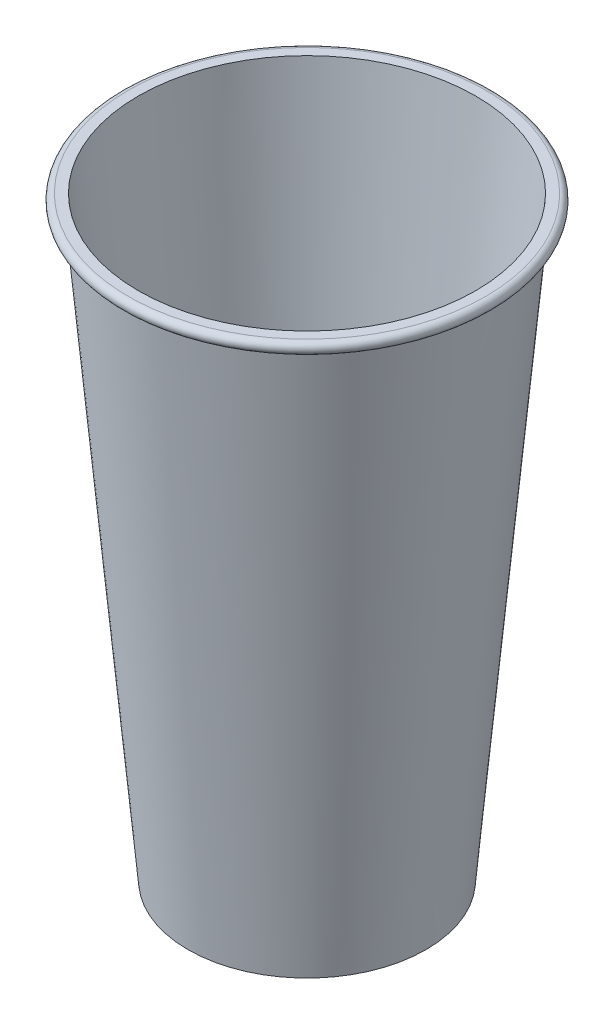
ISO-10303-21;
HEADER;
FILE_DESCRIPTION(('STEP AP214'),'2;1');
FILE_NAME('part.step','',(''),(''),'','','');
FILE_SCHEMA(('AUTOMOTIVE_DESIGN { 1 0 10303 214 1 1 1 1 }'));
ENDSEC;
DATA;
#1=APPLICATION_CONTEXT('core data for automotive mechanical design processes');
#2=APPLICATION_PROTOCOL_DEFINITION('international standard','automotive_design',2000,#1);
#3=PRODUCT_CONTEXT('',#1,'mechanical');
#4=PRODUCT('Part','Part','',(#3));
#5=PRODUCT_RELATED_PRODUCT_CATEGORY('part','',(#4));
#6=PRODUCT_DEFINITION_FORMATION('','',#4);
#7=PRODUCT_DEFINITION_CONTEXT('part definition',#1,'design');
#8=PRODUCT_DEFINITION('design','',#6,#7);
#9=PRODUCT_DEFINITION_SHAPE('','',#8);
#10=(LENGTH_UNIT() NAMED_UNIT(*) SI_UNIT(.MILLI.,.METRE.));
#11=(NAMED_UNIT(*) PLANE_ANGLE_UNIT() SI_UNIT($,.RADIAN.));
#12=(NAMED_UNIT(*) SI_UNIT($,.STERADIAN.) SOLID_ANGLE_UNIT());
#13=UNCERTAINTY_MEASURE_WITH_UNIT(LENGTH_MEASURE(1.E-05),#10,'distance_accuracy_value','');
#14=(GEOMETRIC_REPRESENTATION_CONTEXT(3) GLOBAL_UNCERTAINTY_ASSIGNED_CONTEXT((#13)) GLOBAL_UNIT_ASSIGNED_CONTEXT((#10,
#11,#12)) REPRESENTATION_CONTEXT('',''));
#15=CARTESIAN_POINT('',(0.,0.,0.));
#16=DIRECTION('',(0.,0.,1.));
#17=DIRECTION('',(1.,0.,0.));
#18=AXIS2_PLACEMENT_3D('',#15,#16,#17);
#19=CARTESIAN_POINT('',(0.,-1.,0.));
#20=DIRECTION('',(0.,1.,0.));
#21=DIRECTION('',(0.,0.,1.));
#22=AXIS2_PLACEMENT_3D('',#19,#20,#21);
#23=CYLINDRICAL_SURFACE('',#22,25.);
#24=CARTESIAN_POINT('',(0.,-1.,0.));
#25=DIRECTION('',(0.,-1.,0.));
#26=DIRECTION('',(0.,0.,-1.));
#27=AXIS2_PLACEMENT_3D('',#24,#25,#26);
#28=CIRCLE('',#27,25.);
#29=CARTESIAN_POINT('',(0.,-1.,-25.));
#30=VERTEX_POINT('',#29);
#31=EDGE_CURVE('E12',#30,#30,#28,.T.);
#32=ORIENTED_EDGE('',*,*,#31,.F.);
#33=EDGE_LOOP('',(#32));
#34=FACE_BOUND('',#33,.T.);
#35=CARTESIAN_POINT('',(0.,0.,0.));
#36=DIRECTION('',(0.,-1.,0.));
#37=DIRECTION('',(0.,0.,-1.));
#38=AXIS2_PLACEMENT_3D('',#35,#36,#37);
#39=CIRCLE('',#38,25.);
#40=CARTESIAN_POINT('',(0.,0.,-25.));
#41=VERTEX_POINT('',#40);
#42=EDGE_CURVE('E44',#41,#41,#39,.T.);
#43=ORIENTED_EDGE('',*,*,#42,.T.);
#44=EDGE_LOOP('',(#43));
#45=FACE_BOUND('',#44,.T.);
#46=ADVANCED_FACE('F41',(#34,#45),#23,.T.);
#47=CARTESIAN_POINT('',(0.,-1.,0.));
#48=DIRECTION('',(0.,-1.,0.));
#49=DIRECTION('',(0.,0.,-1.));
#50=AXIS2_PLACEMENT_3D('',#47,#48,#49);
#51=PLANE('',#50);
#52=ORIENTED_EDGE('',*,*,#31,.T.);
#53=EDGE_LOOP('',(#52));
#54=FACE_BOUND('',#53,.T.);
#55=ADVANCED_FACE('F56',(#54),#51,.T.);
#56=CARTESIAN_POINT('',(0.,0.,0.));
#57=DIRECTION('',(0.,-1.,0.));
#58=DIRECTION('',(0.,0.,-1.));
#59=AXIS2_PLACEMENT_3D('',#56,#57,#58);
#60=PLANE('',#59);
#61=ORIENTED_EDGE('',*,*,#42,.F.);
#62=EDGE_LOOP('',(#61));
#63=FACE_BOUND('',#62,.T.);
#64=ADVANCED_FACE('F54',(#63),#60,.F.);
#65=CLOSED_SHELL('',(#46,#55,#64));
#66=MANIFOLD_SOLID_BREP('B2',#65);
#67=CARTESIAN_POINT('',(0.,0.,0.));
#68=DIRECTION('',(0.,1.,0.));
#69=DIRECTION('',(0.,0.,1.));
#70=AXIS2_PLACEMENT_3D('',#67,#68,#69);
#71=CONICAL_SURFACE('',#70,30.,0.0897581741899505);
#72=CARTESIAN_POINT('',(0.,0.,0.));
#73=DIRECTION('',(0.,1.,0.));
#74=DIRECTION('',(0.,0.,1.));
#75=AXIS2_PLACEMENT_3D('',#72,#73,#74);
#76=CIRCLE('',#75,30.);
#77=CARTESIAN_POINT('',(0.,0.,30.));
#78=VERTEX_POINT('',#77);
#79=EDGE_CURVE('E40',#78,#78,#76,.T.);
#80=ORIENTED_EDGE('',*,*,#79,.T.);
#81=EDGE_LOOP('',(#80));
#82=FACE_BOUND('',#81,.T.);
#83=CARTESIAN_POINT('',(0.,147.,0.));
#84=DIRECTION('',(0.,1.,0.));
#85=DIRECTION('',(-1.,0.,0.));
#86=AXIS2_PLACEMENT_3D('',#83,#84,#85);
#87=CIRCLE('',#86,43.23);
#88=CARTESIAN_POINT('',(-43.23,147.,0.));
#89=VERTEX_POINT('',#88);
#90=EDGE_CURVE('E143',#89,#89,#87,.T.);
#91=ORIENTED_EDGE('',*,*,#90,.F.);
#92=EDGE_LOOP('',(#91));
#93=FACE_BOUND('',#92,.T.);
#94=ADVANCED_FACE('F82',(#82,#93),#71,.T.);
#95=CARTESIAN_POINT('',(0.,0.,0.));
#96=DIRECTION('',(0.,1.,0.));
#97=DIRECTION('',(0.,0.,1.));
#98=AXIS2_PLACEMENT_3D('',#95,#96,#97);
#99=PLANE('',#98);
#100=CARTESIAN_POINT('',(0.,0.,0.));
#101=DIRECTION('',(0.,1.,0.));
#102=DIRECTION('',(0.,0.,1.));
#103=AXIS2_PLACEMENT_3D('',#100,#101,#102);
#104=CIRCLE('',#103,28.9959581682021);
#105=CARTESIAN_POINT('',(0.,0.,28.9959581682021));
#106=VERTEX_POINT('',#105);
#107=EDGE_CURVE('E91',#106,#106,#104,.T.);
#108=ORIENTED_EDGE('',*,*,#107,.T.);
#109=EDGE_LOOP('',(#108));
#110=FACE_BOUND('',#109,.T.);
#111=ORIENTED_EDGE('',*,*,#79,.F.);
#112=EDGE_LOOP('',(#111));
#113=FACE_BOUND('',#112,.T.);
#114=ADVANCED_FACE('F84',(#110,#113),#99,.F.);
#115=CARTESIAN_POINT('',(0.,150.,0.));
#116=DIRECTION('',(0.,1.,0.));
#117=DIRECTION('',(0.,0.,1.));
#118=AXIS2_PLACEMENT_3D('',#115,#116,#117);
#119=PLANE('',#118);
#120=CARTESIAN_POINT('',(0.,150.,0.));
#121=DIRECTION('',(0.,1.,0.));
#122=DIRECTION('',(0.,0.,1.));
#123=AXIS2_PLACEMENT_3D('',#120,#121,#122);
#124=CIRCLE('',#123,42.4959581682021);
#125=CARTESIAN_POINT('',(0.,150.,42.4959581682021));
#126=VERTEX_POINT('',#125);
#127=EDGE_CURVE('E96',#126,#126,#124,.T.);
#128=ORIENTED_EDGE('',*,*,#127,.F.);
#129=EDGE_LOOP('',(#128));
#130=FACE_BOUND('',#129,.T.);
#131=CARTESIAN_POINT('',(0.,150.,0.));
#132=DIRECTION('',(0.,1.,0.));
#133=DIRECTION('',(-1.,0.,0.));
#134=AXIS2_PLACEMENT_3D('',#131,#132,#133);
#135=CIRCLE('',#134,45.);
#136=CARTESIAN_POINT('',(-45.,150.,0.));
#137=VERTEX_POINT('',#136);
#138=EDGE_CURVE('E139',#137,#137,#135,.T.);
#139=ORIENTED_EDGE('',*,*,#138,.T.);
#140=EDGE_LOOP('',(#139));
#141=FACE_BOUND('',#140,.T.);
#142=ADVANCED_FACE('F119',(#130,#141),#119,.T.);
#143=CARTESIAN_POINT('',(0.,0.0896376994958906,0.));
#144=DIRECTION('',(0.,1.,0.));
#145=DIRECTION('',(0.,0.,1.));
#146=AXIS2_PLACEMENT_3D('',#143,#144,#145);
#147=CONICAL_SURFACE('',#146,29.0040255611568,0.0897581741899505);
#148=ORIENTED_EDGE('',*,*,#127,.T.);
#149=EDGE_LOOP('',(#148));
#150=FACE_BOUND('',#149,.T.);
#151=ORIENTED_EDGE('',*,*,#107,.F.);
#152=EDGE_LOOP('',(#151));
#153=FACE_BOUND('',#152,.T.);
#154=ADVANCED_FACE('F122',(#150,#153),#147,.F.);
#155=CARTESIAN_POINT('',(43.23,147.,0.));
#156=DIRECTION('',(0.,1.,0.));
#157=DIRECTION('',(-1.,0.,0.));
#158=AXIS2_PLACEMENT_3D('',#155,#156,#157);
#159=PLANE('',#158);
#160=CARTESIAN_POINT('',(0.,147.,0.));
#161=DIRECTION('',(0.,1.,0.));
#162=DIRECTION('',(-1.,0.,0.));
#163=AXIS2_PLACEMENT_3D('',#160,#161,#162);
#164=CIRCLE('',#163,45.);
#165=CARTESIAN_POINT('',(-45.,147.,0.));
#166=VERTEX_POINT('',#165);
#167=EDGE_CURVE('E142',#166,#166,#164,.T.);
#168=ORIENTED_EDGE('',*,*,#167,.F.);
#169=EDGE_LOOP('',(#168));
#170=FACE_BOUND('',#169,.T.);
#171=ORIENTED_EDGE('',*,*,#90,.T.);
#172=EDGE_LOOP('',(#171));
#173=FACE_BOUND('',#172,.T.);
#174=ADVANCED_FACE('F126',(#170,#173),#159,.F.);
#175=CARTESIAN_POINT('',(0.,148.5,0.));
#176=DIRECTION('',(0.,1.,0.));
#177=DIRECTION('',(-1.,0.,0.));
#178=AXIS2_PLACEMENT_3D('',#175,#176,#177);
#179=TOROIDAL_SURFACE('',#178,45.,1.5);
#180=ORIENTED_EDGE('',*,*,#138,.F.);
#181=EDGE_LOOP('',(#180));
#182=FACE_BOUND('',#181,.T.);
#183=ORIENTED_EDGE('',*,*,#167,.T.);
#184=EDGE_LOOP('',(#183));
#185=FACE_BOUND('',#184,.T.);
#186=ADVANCED_FACE('F130',(#182,#185),#179,.T.);
#187=CLOSED_SHELL('',(#94,#114,#142,#154,#174,#186));
#188=MANIFOLD_SOLID_BREP('B7',#187);
#189=ADVANCED_BREP_SHAPE_REPRESENTATION('',(#18,#66,#188),#14);
#190=SHAPE_DEFINITION_REPRESENTATION(#9,#189);
ENDSEC;
END-ISO-10303-21;
